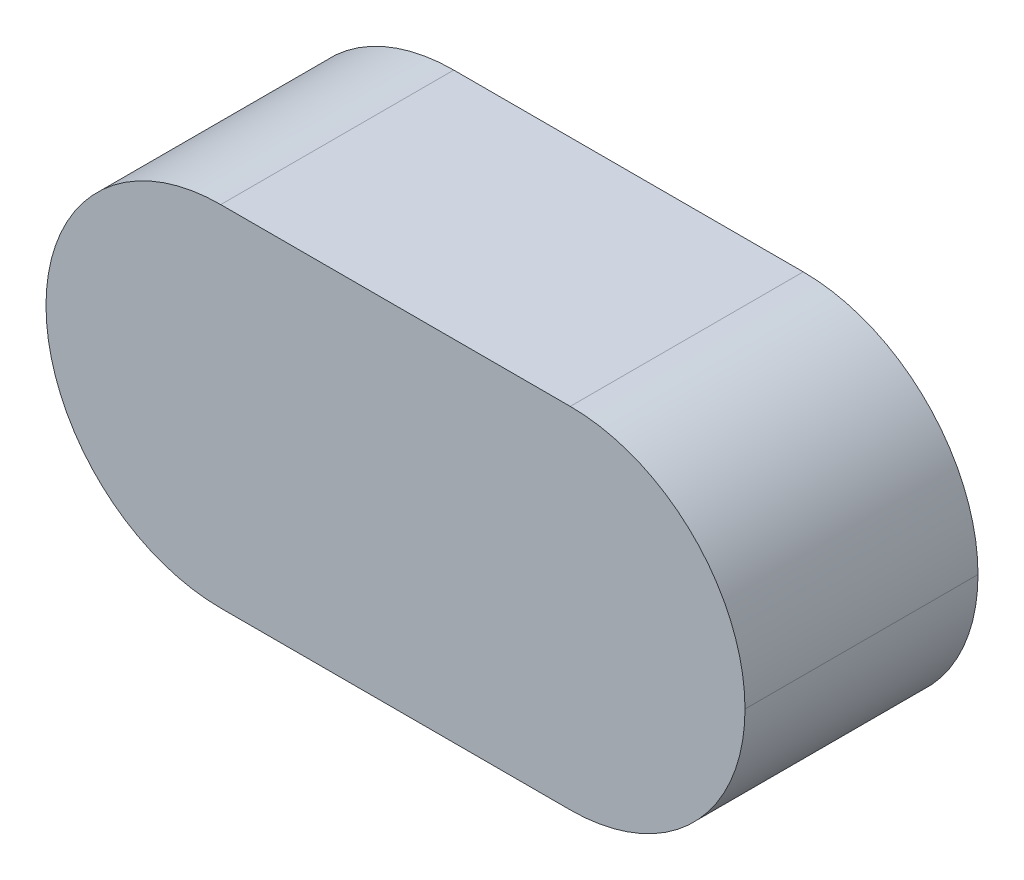
ISO-10303-21;
HEADER;
FILE_DESCRIPTION(('STEP AP214'),'2;1');
FILE_NAME('part.step','',(''),(''),'','','');
FILE_SCHEMA(('AUTOMOTIVE_DESIGN { 1 0 10303 214 1 1 1 1 }'));
ENDSEC;
DATA;
#1=APPLICATION_CONTEXT('core data for automotive mechanical design processes');
#2=APPLICATION_PROTOCOL_DEFINITION('international standard','automotive_design',2000,#1);
#3=PRODUCT_CONTEXT('',#1,'mechanical');
#4=PRODUCT('Part','Part','',(#3));
#5=PRODUCT_RELATED_PRODUCT_CATEGORY('part','',(#4));
#6=PRODUCT_DEFINITION_FORMATION('','',#4);
#7=PRODUCT_DEFINITION_CONTEXT('part definition',#1,'design');
#8=PRODUCT_DEFINITION('design','',#6,#7);
#9=PRODUCT_DEFINITION_SHAPE('','',#8);
#10=(LENGTH_UNIT() NAMED_UNIT(*) SI_UNIT(.MILLI.,.METRE.));
#11=(NAMED_UNIT(*) PLANE_ANGLE_UNIT() SI_UNIT($,.RADIAN.));
#12=(NAMED_UNIT(*) SI_UNIT($,.STERADIAN.) SOLID_ANGLE_UNIT());
#13=UNCERTAINTY_MEASURE_WITH_UNIT(LENGTH_MEASURE(1.E-05),#10,'distance_accuracy_value','');
#14=(GEOMETRIC_REPRESENTATION_CONTEXT(3) GLOBAL_UNCERTAINTY_ASSIGNED_CONTEXT((#13)) GLOBAL_UNIT_ASSIGNED_CONTEXT((#10,
#11,#12)) REPRESENTATION_CONTEXT('',''));
#15=CARTESIAN_POINT('',(0.,0.,0.));
#16=DIRECTION('',(0.,0.,1.));
#17=DIRECTION('',(1.,0.,0.));
#18=AXIS2_PLACEMENT_3D('',#15,#16,#17);
#19=CARTESIAN_POINT('',(0.,0.,10.));
#20=DIRECTION('',(0.,1.,0.));
#21=DIRECTION('',(0.,0.,1.));
#22=AXIS2_PLACEMENT_3D('',#19,#20,#21);
#23=PLANE('',#22);
#24=DIRECTION('',(1.,0.,0.));
#25=VECTOR('',#24,1.);
#26=CARTESIAN_POINT('',(0.,0.,0.));
#27=LINE('',#26,#25);
#28=CARTESIAN_POINT('',(7.5,0.,0.));
#29=VERTEX_POINT('',#28);
#30=CARTESIAN_POINT('',(22.5,0.,0.));
#31=VERTEX_POINT('',#30);
#32=EDGE_CURVE('E105',#29,#31,#27,.T.);
#33=ORIENTED_EDGE('',*,*,#32,.T.);
#34=DIRECTION('',(0.,0.,-1.));
#35=VECTOR('',#34,1.);
#36=CARTESIAN_POINT('',(22.5,0.,10.));
#37=LINE('',#36,#35);
#38=CARTESIAN_POINT('',(22.5,0.,10.));
#39=VERTEX_POINT('',#38);
#40=EDGE_CURVE('E145',#31,#39,#37,.F.);
#41=ORIENTED_EDGE('',*,*,#40,.T.);
#42=DIRECTION('',(1.,0.,0.));
#43=VECTOR('',#42,1.);
#44=CARTESIAN_POINT('',(0.,0.,10.));
#45=LINE('',#44,#43);
#46=CARTESIAN_POINT('',(7.5,0.,10.));
#47=VERTEX_POINT('',#46);
#48=EDGE_CURVE('E158',#47,#39,#45,.T.);
#49=ORIENTED_EDGE('',*,*,#48,.F.);
#50=DIRECTION('',(0.,0.,-1.));
#51=VECTOR('',#50,1.);
#52=CARTESIAN_POINT('',(7.5,0.,10.));
#53=LINE('',#52,#51);
#54=EDGE_CURVE('E149',#47,#29,#53,.T.);
#55=ORIENTED_EDGE('',*,*,#54,.T.);
#56=EDGE_LOOP('',(#33,#41,#49,#55));
#57=FACE_BOUND('',#56,.T.);
#58=ADVANCED_FACE('F45',(#57),#23,.F.);
#59=CARTESIAN_POINT('',(0.,15.,10.));
#60=DIRECTION('',(0.,-1.,0.));
#61=DIRECTION('',(0.,0.,-1.));
#62=AXIS2_PLACEMENT_3D('',#59,#60,#61);
#63=PLANE('',#62);
#64=DIRECTION('',(-1.,0.,0.));
#65=VECTOR('',#64,1.);
#66=CARTESIAN_POINT('',(0.,15.,10.));
#67=LINE('',#66,#65);
#68=CARTESIAN_POINT('',(22.5,15.,10.));
#69=VERTEX_POINT('',#68);
#70=CARTESIAN_POINT('',(7.5,15.,10.));
#71=VERTEX_POINT('',#70);
#72=EDGE_CURVE('E118',#69,#71,#67,.T.);
#73=ORIENTED_EDGE('',*,*,#72,.F.);
#74=DIRECTION('',(0.,0.,-1.));
#75=VECTOR('',#74,1.);
#76=CARTESIAN_POINT('',(22.5,15.,10.));
#77=LINE('',#76,#75);
#78=CARTESIAN_POINT('',(22.5,15.,0.));
#79=VERTEX_POINT('',#78);
#80=EDGE_CURVE('E11',#69,#79,#77,.T.);
#81=ORIENTED_EDGE('',*,*,#80,.T.);
#82=DIRECTION('',(-1.,0.,0.));
#83=VECTOR('',#82,1.);
#84=CARTESIAN_POINT('',(0.,15.,0.));
#85=LINE('',#84,#83);
#86=CARTESIAN_POINT('',(7.5,15.,0.));
#87=VERTEX_POINT('',#86);
#88=EDGE_CURVE('E130',#79,#87,#85,.T.);
#89=ORIENTED_EDGE('',*,*,#88,.T.);
#90=DIRECTION('',(0.,0.,-1.));
#91=VECTOR('',#90,1.);
#92=CARTESIAN_POINT('',(7.5,15.,10.));
#93=LINE('',#92,#91);
#94=EDGE_CURVE('E55',#87,#71,#93,.F.);
#95=ORIENTED_EDGE('',*,*,#94,.T.);
#96=EDGE_LOOP('',(#73,#81,#89,#95));
#97=FACE_BOUND('',#96,.T.);
#98=ADVANCED_FACE('F173',(#97),#63,.F.);
#99=CARTESIAN_POINT('',(0.,0.,10.));
#100=DIRECTION('',(0.,0.,-1.));
#101=DIRECTION('',(-1.,0.,0.));
#102=AXIS2_PLACEMENT_3D('',#99,#100,#101);
#103=PLANE('',#102);
#104=ORIENTED_EDGE('',*,*,#48,.T.);
#105=CARTESIAN_POINT('',(22.5,7.5,10.));
#106=DIRECTION('',(0.,0.,-1.));
#107=DIRECTION('',(-1.,0.,0.));
#108=AXIS2_PLACEMENT_3D('',#105,#106,#107);
#109=CIRCLE('',#108,7.5);
#110=CARTESIAN_POINT('',(30.,7.5,10.));
#111=VERTEX_POINT('',#110);
#112=EDGE_CURVE('E135',#39,#111,#109,.F.);
#113=ORIENTED_EDGE('',*,*,#112,.T.);
#114=CARTESIAN_POINT('',(22.5,7.5,10.));
#115=DIRECTION('',(0.,0.,-1.));
#116=DIRECTION('',(-1.,0.,0.));
#117=AXIS2_PLACEMENT_3D('',#114,#115,#116);
#118=CIRCLE('',#117,7.5);
#119=EDGE_CURVE('E69',#111,#69,#118,.F.);
#120=ORIENTED_EDGE('',*,*,#119,.T.);
#121=ORIENTED_EDGE('',*,*,#72,.T.);
#122=CARTESIAN_POINT('',(7.5,7.5,10.));
#123=DIRECTION('',(0.,0.,-1.));
#124=DIRECTION('',(-1.,0.,0.));
#125=AXIS2_PLACEMENT_3D('',#122,#123,#124);
#126=CIRCLE('',#125,7.5);
#127=CARTESIAN_POINT('',(0.,7.5,10.));
#128=VERTEX_POINT('',#127);
#129=EDGE_CURVE('E142',#71,#128,#126,.F.);
#130=ORIENTED_EDGE('',*,*,#129,.T.);
#131=CARTESIAN_POINT('',(7.5,7.5,10.));
#132=DIRECTION('',(0.,0.,-1.));
#133=DIRECTION('',(-1.,0.,0.));
#134=AXIS2_PLACEMENT_3D('',#131,#132,#133);
#135=CIRCLE('',#134,7.5);
#136=EDGE_CURVE('E121',#128,#47,#135,.F.);
#137=ORIENTED_EDGE('',*,*,#136,.T.);
#138=EDGE_LOOP('',(#104,#113,#120,#121,#130,#137));
#139=FACE_BOUND('',#138,.T.);
#140=ADVANCED_FACE('F165',(#139),#103,.F.);
#141=CARTESIAN_POINT('',(0.,0.,0.));
#142=DIRECTION('',(0.,0.,-1.));
#143=DIRECTION('',(-1.,0.,0.));
#144=AXIS2_PLACEMENT_3D('',#141,#142,#143);
#145=PLANE('',#144);
#146=CARTESIAN_POINT('',(22.5,7.5,0.));
#147=DIRECTION('',(0.,0.,-1.));
#148=DIRECTION('',(-1.,0.,0.));
#149=AXIS2_PLACEMENT_3D('',#146,#147,#148);
#150=CIRCLE('',#149,7.5);
#151=CARTESIAN_POINT('',(30.,7.5,0.));
#152=VERTEX_POINT('',#151);
#153=EDGE_CURVE('E111',#79,#152,#150,.T.);
#154=ORIENTED_EDGE('',*,*,#153,.T.);
#155=CARTESIAN_POINT('',(22.5,7.5,0.));
#156=DIRECTION('',(0.,0.,-1.));
#157=DIRECTION('',(-1.,0.,0.));
#158=AXIS2_PLACEMENT_3D('',#155,#156,#157);
#159=CIRCLE('',#158,7.5);
#160=EDGE_CURVE('E152',#152,#31,#159,.T.);
#161=ORIENTED_EDGE('',*,*,#160,.T.);
#162=ORIENTED_EDGE('',*,*,#32,.F.);
#163=CARTESIAN_POINT('',(7.5,7.5,0.));
#164=DIRECTION('',(0.,0.,-1.));
#165=DIRECTION('',(-1.,0.,0.));
#166=AXIS2_PLACEMENT_3D('',#163,#164,#165);
#167=CIRCLE('',#166,7.5);
#168=CARTESIAN_POINT('',(0.,7.5,0.));
#169=VERTEX_POINT('',#168);
#170=EDGE_CURVE('E99',#29,#169,#167,.T.);
#171=ORIENTED_EDGE('',*,*,#170,.T.);
#172=CARTESIAN_POINT('',(7.5,7.5,0.));
#173=DIRECTION('',(0.,0.,-1.));
#174=DIRECTION('',(-1.,0.,0.));
#175=AXIS2_PLACEMENT_3D('',#172,#173,#174);
#176=CIRCLE('',#175,7.5);
#177=EDGE_CURVE('E103',#169,#87,#176,.T.);
#178=ORIENTED_EDGE('',*,*,#177,.T.);
#179=ORIENTED_EDGE('',*,*,#88,.F.);
#180=EDGE_LOOP('',(#154,#161,#162,#171,#178,#179));
#181=FACE_BOUND('',#180,.T.);
#182=ADVANCED_FACE('F101',(#181),#145,.T.);
#183=CARTESIAN_POINT('',(22.5,7.5,10.));
#184=DIRECTION('',(0.,0.,-1.));
#185=DIRECTION('',(-1.,0.,0.));
#186=AXIS2_PLACEMENT_3D('',#183,#184,#185);
#187=CYLINDRICAL_SURFACE('',#186,7.5);
#188=ORIENTED_EDGE('',*,*,#80,.F.);
#189=ORIENTED_EDGE('',*,*,#119,.F.);
#190=DIRECTION('',(0.,0.,-1.));
#191=VECTOR('',#190,1.);
#192=CARTESIAN_POINT('',(30.,7.5,10.));
#193=LINE('',#192,#191);
#194=EDGE_CURVE('E123',#152,#111,#193,.F.);
#195=ORIENTED_EDGE('',*,*,#194,.F.);
#196=ORIENTED_EDGE('',*,*,#153,.F.);
#197=EDGE_LOOP('',(#188,#189,#195,#196));
#198=FACE_BOUND('',#197,.T.);
#199=ADVANCED_FACE('F172',(#198),#187,.T.);
#200=CARTESIAN_POINT('',(22.5,7.5,10.));
#201=DIRECTION('',(0.,0.,-1.));
#202=DIRECTION('',(-1.,0.,0.));
#203=AXIS2_PLACEMENT_3D('',#200,#201,#202);
#204=CYLINDRICAL_SURFACE('',#203,7.5);
#205=ORIENTED_EDGE('',*,*,#112,.F.);
#206=ORIENTED_EDGE('',*,*,#40,.F.);
#207=ORIENTED_EDGE('',*,*,#160,.F.);
#208=ORIENTED_EDGE('',*,*,#194,.T.);
#209=EDGE_LOOP('',(#205,#206,#207,#208));
#210=FACE_BOUND('',#209,.T.);
#211=ADVANCED_FACE('F168',(#210),#204,.T.);
#212=CARTESIAN_POINT('',(7.5,7.5,10.));
#213=DIRECTION('',(0.,0.,-1.));
#214=DIRECTION('',(-1.,0.,0.));
#215=AXIS2_PLACEMENT_3D('',#212,#213,#214);
#216=CYLINDRICAL_SURFACE('',#215,7.5);
#217=DIRECTION('',(0.,0.,-1.));
#218=VECTOR('',#217,1.);
#219=CARTESIAN_POINT('',(0.,7.5,10.));
#220=LINE('',#219,#218);
#221=EDGE_CURVE('E49',#128,#169,#220,.T.);
#222=ORIENTED_EDGE('',*,*,#221,.F.);
#223=ORIENTED_EDGE('',*,*,#129,.F.);
#224=ORIENTED_EDGE('',*,*,#94,.F.);
#225=ORIENTED_EDGE('',*,*,#177,.F.);
#226=EDGE_LOOP('',(#222,#223,#224,#225));
#227=FACE_BOUND('',#226,.T.);
#228=ADVANCED_FACE('F47',(#227),#216,.T.);
#229=CARTESIAN_POINT('',(7.5,7.5,10.));
#230=DIRECTION('',(0.,0.,-1.));
#231=DIRECTION('',(-1.,0.,0.));
#232=AXIS2_PLACEMENT_3D('',#229,#230,#231);
#233=CYLINDRICAL_SURFACE('',#232,7.5);
#234=ORIENTED_EDGE('',*,*,#136,.F.);
#235=ORIENTED_EDGE('',*,*,#221,.T.);
#236=ORIENTED_EDGE('',*,*,#170,.F.);
#237=ORIENTED_EDGE('',*,*,#54,.F.);
#238=EDGE_LOOP('',(#234,#235,#236,#237));
#239=FACE_BOUND('',#238,.T.);
#240=ADVANCED_FACE('F120',(#239),#233,.T.);
#241=CLOSED_SHELL('',(#58,#98,#140,#182,#199,#211,#228,#240));
#242=MANIFOLD_SOLID_BREP('B2',#241);
#243=ADVANCED_BREP_SHAPE_REPRESENTATION('',(#18,#242),#14);
#244=SHAPE_DEFINITION_REPRESENTATION(#9,#243);
ENDSEC;
END-ISO-10303-21;
